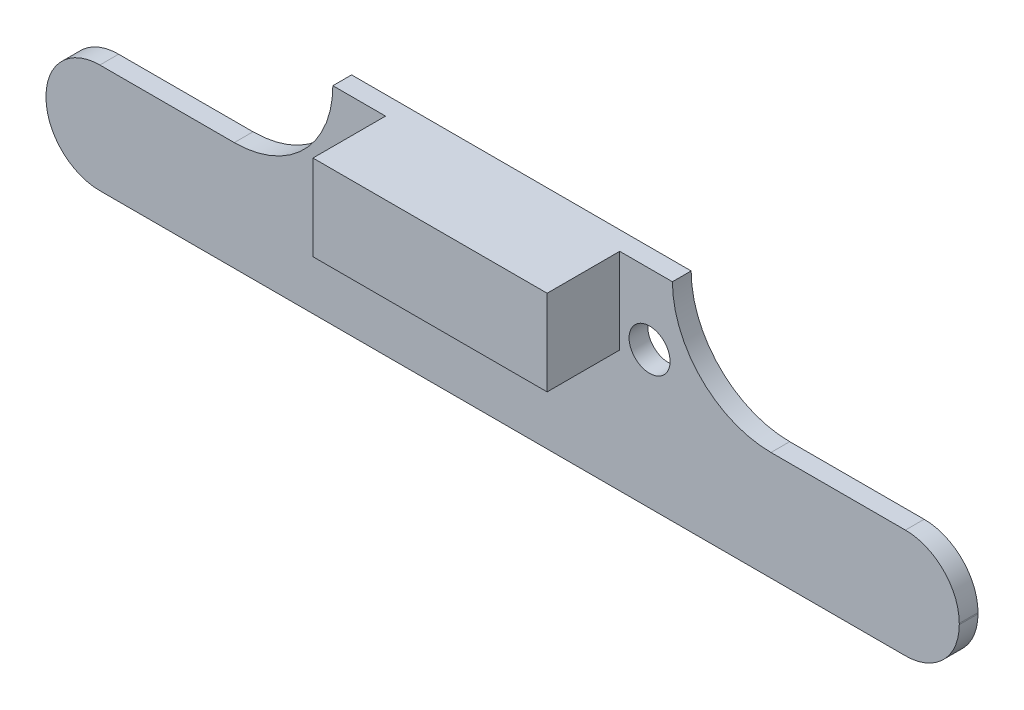
ISO-10303-21;
HEADER;
FILE_DESCRIPTION(('STEP AP214'),'2;1');
FILE_NAME('part.step','',(''),(''),'','','');
FILE_SCHEMA(('AUTOMOTIVE_DESIGN { 1 0 10303 214 1 1 1 1 }'));
ENDSEC;
DATA;
#1=APPLICATION_CONTEXT('core data for automotive mechanical design processes');
#2=APPLICATION_PROTOCOL_DEFINITION('international standard','automotive_design',2000,#1);
#3=PRODUCT_CONTEXT('',#1,'mechanical');
#4=PRODUCT('Part','Part','',(#3));
#5=PRODUCT_RELATED_PRODUCT_CATEGORY('part','',(#4));
#6=PRODUCT_DEFINITION_FORMATION('','',#4);
#7=PRODUCT_DEFINITION_CONTEXT('part definition',#1,'design');
#8=PRODUCT_DEFINITION('design','',#6,#7);
#9=PRODUCT_DEFINITION_SHAPE('','',#8);
#10=(LENGTH_UNIT() NAMED_UNIT(*) SI_UNIT(.MILLI.,.METRE.));
#11=(NAMED_UNIT(*) PLANE_ANGLE_UNIT() SI_UNIT($,.RADIAN.));
#12=(NAMED_UNIT(*) SI_UNIT($,.STERADIAN.) SOLID_ANGLE_UNIT());
#13=UNCERTAINTY_MEASURE_WITH_UNIT(LENGTH_MEASURE(1.E-05),#10,'distance_accuracy_value','');
#14=(GEOMETRIC_REPRESENTATION_CONTEXT(3) GLOBAL_UNCERTAINTY_ASSIGNED_CONTEXT((#13)) GLOBAL_UNIT_ASSIGNED_CONTEXT((#10,
#11,#12)) REPRESENTATION_CONTEXT('',''));
#15=CARTESIAN_POINT('',(0.,0.,0.));
#16=DIRECTION('',(0.,0.,1.));
#17=DIRECTION('',(1.,0.,0.));
#18=AXIS2_PLACEMENT_3D('',#15,#16,#17);
#19=CARTESIAN_POINT('',(73.4,4.7,1.6));
#20=DIRECTION('',(0.,0.,-1.));
#21=DIRECTION('',(-1.,0.,0.));
#22=AXIS2_PLACEMENT_3D('',#19,#20,#21);
#23=PLANE('',#22);
#24=CARTESIAN_POINT('',(51.55,11.72,1.6));
#25=DIRECTION('',(0.,0.,1.));
#26=DIRECTION('',(-1.,0.,0.));
#27=AXIS2_PLACEMENT_3D('',#24,#25,#26);
#28=CIRCLE('',#27,1.75);
#29=CARTESIAN_POINT('',(49.8,11.72,1.6));
#30=VERTEX_POINT('',#29);
#31=EDGE_CURVE('E201',#30,#30,#28,.T.);
#32=ORIENTED_EDGE('',*,*,#31,.F.);
#33=EDGE_LOOP('',(#32));
#34=FACE_BOUND('',#33,.T.);
#35=CARTESIAN_POINT('',(26.45,11.72,1.6));
#36=DIRECTION('',(0.,0.,1.));
#37=DIRECTION('',(1.,0.,0.));
#38=AXIS2_PLACEMENT_3D('',#35,#36,#37);
#39=CIRCLE('',#38,1.75);
#40=CARTESIAN_POINT('',(28.2,11.72,1.6));
#41=VERTEX_POINT('',#40);
#42=EDGE_CURVE('E249',#41,#41,#39,.T.);
#43=ORIENTED_EDGE('',*,*,#42,.F.);
#44=EDGE_LOOP('',(#43));
#45=FACE_BOUND('',#44,.T.);
#46=DIRECTION('',(0.,1.,0.));
#47=VECTOR('',#46,1.);
#48=CARTESIAN_POINT('',(49.,10.42,1.6));
#49=LINE('',#48,#47);
#50=CARTESIAN_POINT('',(49.,10.42,1.6));
#51=VERTEX_POINT('',#50);
#52=CARTESIAN_POINT('',(49.,17.72,1.6));
#53=VERTEX_POINT('',#52);
#54=EDGE_CURVE('E43',#51,#53,#49,.T.);
#55=ORIENTED_EDGE('',*,*,#54,.F.);
#56=DIRECTION('',(1.,0.,0.));
#57=VECTOR('',#56,1.);
#58=CARTESIAN_POINT('',(29.,10.42,1.6));
#59=LINE('',#58,#57);
#60=CARTESIAN_POINT('',(29.,10.42,1.6));
#61=VERTEX_POINT('',#60);
#62=EDGE_CURVE('E192',#61,#51,#59,.T.);
#63=ORIENTED_EDGE('',*,*,#62,.F.);
#64=DIRECTION('',(0.,-1.,0.));
#65=VECTOR('',#64,1.);
#66=CARTESIAN_POINT('',(29.,10.42,1.6));
#67=LINE('',#66,#65);
#68=CARTESIAN_POINT('',(29.,17.72,1.6));
#69=VERTEX_POINT('',#68);
#70=EDGE_CURVE('E69',#69,#61,#67,.T.);
#71=ORIENTED_EDGE('',*,*,#70,.F.);
#72=DIRECTION('',(-1.,0.,0.));
#73=VECTOR('',#72,1.);
#74=CARTESIAN_POINT('',(24.5,17.72,1.6));
#75=LINE('',#74,#73);
#76=CARTESIAN_POINT('',(24.5,17.72,1.6));
#77=VERTEX_POINT('',#76);
#78=EDGE_CURVE('E214',#69,#77,#75,.T.);
#79=ORIENTED_EDGE('',*,*,#78,.T.);
#80=CARTESIAN_POINT('',(16.08,17.72,1.6));
#81=DIRECTION('',(0.,0.,-1.));
#82=DIRECTION('',(-1.,0.,0.));
#83=AXIS2_PLACEMENT_3D('',#80,#81,#82);
#84=CIRCLE('',#83,8.42);
#85=CARTESIAN_POINT('',(16.08,9.30000000000001,1.6));
#86=VERTEX_POINT('',#85);
#87=EDGE_CURVE('E224',#77,#86,#84,.T.);
#88=ORIENTED_EDGE('',*,*,#87,.T.);
#89=DIRECTION('',(-1.,0.,0.));
#90=VECTOR('',#89,1.);
#91=CARTESIAN_POINT('',(4.60000000000003,9.3,1.6));
#92=LINE('',#91,#90);
#93=CARTESIAN_POINT('',(4.60000000000003,9.3,1.6));
#94=VERTEX_POINT('',#93);
#95=EDGE_CURVE('E228',#86,#94,#92,.T.);
#96=ORIENTED_EDGE('',*,*,#95,.T.);
#97=CARTESIAN_POINT('',(4.6,4.7,1.6));
#98=DIRECTION('',(0.,0.,1.));
#99=DIRECTION('',(-1.,0.,0.));
#100=AXIS2_PLACEMENT_3D('',#97,#98,#99);
#101=CIRCLE('',#100,4.6);
#102=CARTESIAN_POINT('',(0.,4.69999999999997,1.6));
#103=VERTEX_POINT('',#102);
#104=EDGE_CURVE('E230',#94,#103,#101,.T.);
#105=ORIENTED_EDGE('',*,*,#104,.T.);
#106=DIRECTION('',(0.,-1.,0.));
#107=VECTOR('',#106,1.);
#108=CARTESIAN_POINT('',(0.,4.60000000000003,1.6));
#109=LINE('',#108,#107);
#110=CARTESIAN_POINT('',(0.,4.60000000000003,1.6));
#111=VERTEX_POINT('',#110);
#112=EDGE_CURVE('E232',#103,#111,#109,.T.);
#113=ORIENTED_EDGE('',*,*,#112,.T.);
#114=CARTESIAN_POINT('',(4.6,4.6,1.6));
#115=DIRECTION('',(0.,0.,1.));
#116=DIRECTION('',(1.,0.,0.));
#117=AXIS2_PLACEMENT_3D('',#114,#115,#116);
#118=CIRCLE('',#117,4.6);
#119=CARTESIAN_POINT('',(4.60000000000003,0.,1.6));
#120=VERTEX_POINT('',#119);
#121=EDGE_CURVE('E234',#111,#120,#118,.T.);
#122=ORIENTED_EDGE('',*,*,#121,.T.);
#123=DIRECTION('',(1.,0.,0.));
#124=VECTOR('',#123,1.);
#125=CARTESIAN_POINT('',(4.60000000000003,0.,1.6));
#126=LINE('',#125,#124);
#127=CARTESIAN_POINT('',(73.4,0.,1.6));
#128=VERTEX_POINT('',#127);
#129=EDGE_CURVE('E236',#120,#128,#126,.T.);
#130=ORIENTED_EDGE('',*,*,#129,.T.);
#131=CARTESIAN_POINT('',(73.4,4.6,1.6));
#132=DIRECTION('',(0.,0.,1.));
#133=DIRECTION('',(1.,0.,0.));
#134=AXIS2_PLACEMENT_3D('',#131,#132,#133);
#135=CIRCLE('',#134,4.6);
#136=CARTESIAN_POINT('',(78.,4.60000000000003,1.6));
#137=VERTEX_POINT('',#136);
#138=EDGE_CURVE('E239',#128,#137,#135,.T.);
#139=ORIENTED_EDGE('',*,*,#138,.T.);
#140=DIRECTION('',(0.,1.,0.));
#141=VECTOR('',#140,1.);
#142=CARTESIAN_POINT('',(78.,4.60000000000003,1.6));
#143=LINE('',#142,#141);
#144=CARTESIAN_POINT('',(78.,4.69999999999997,1.6));
#145=VERTEX_POINT('',#144);
#146=EDGE_CURVE('E241',#137,#145,#143,.T.);
#147=ORIENTED_EDGE('',*,*,#146,.T.);
#148=CARTESIAN_POINT('',(73.4,4.7,1.6));
#149=DIRECTION('',(0.,0.,1.));
#150=DIRECTION('',(-1.,0.,0.));
#151=AXIS2_PLACEMENT_3D('',#148,#149,#150);
#152=CIRCLE('',#151,4.6);
#153=CARTESIAN_POINT('',(73.4,9.3,1.6));
#154=VERTEX_POINT('',#153);
#155=EDGE_CURVE('E275',#145,#154,#152,.T.);
#156=ORIENTED_EDGE('',*,*,#155,.T.);
#157=DIRECTION('',(-1.,0.,0.));
#158=VECTOR('',#157,1.);
#159=CARTESIAN_POINT('',(61.92,9.30000000000001,1.6));
#160=LINE('',#159,#158);
#161=CARTESIAN_POINT('',(61.92,9.30000000000001,1.6));
#162=VERTEX_POINT('',#161);
#163=EDGE_CURVE('E359',#154,#162,#160,.T.);
#164=ORIENTED_EDGE('',*,*,#163,.T.);
#165=CARTESIAN_POINT('',(61.92,17.72,1.6));
#166=DIRECTION('',(0.,0.,-1.));
#167=DIRECTION('',(1.,0.,0.));
#168=AXIS2_PLACEMENT_3D('',#165,#166,#167);
#169=CIRCLE('',#168,8.42);
#170=CARTESIAN_POINT('',(53.5,17.72,1.6));
#171=VERTEX_POINT('',#170);
#172=EDGE_CURVE('E219',#162,#171,#169,.T.);
#173=ORIENTED_EDGE('',*,*,#172,.T.);
#174=EDGE_CURVE('E218',#171,#53,#75,.T.);
#175=ORIENTED_EDGE('',*,*,#174,.T.);
#176=EDGE_LOOP('',(#55,#63,#71,#79,#88,#96,#105,#113,#122,#130,#139,#147,#156,#164,#173,#175));
#177=FACE_BOUND('',#176,.T.);
#178=ADVANCED_FACE('F39',(#34,#45,#177),#23,.F.);
#179=CARTESIAN_POINT('',(73.4,4.7,0.));
#180=DIRECTION('',(0.,0.,-1.));
#181=DIRECTION('',(-1.,0.,0.));
#182=AXIS2_PLACEMENT_3D('',#179,#180,#181);
#183=PLANE('',#182);
#184=CARTESIAN_POINT('',(26.45,11.72,0.));
#185=DIRECTION('',(0.,0.,1.));
#186=DIRECTION('',(1.,0.,0.));
#187=AXIS2_PLACEMENT_3D('',#184,#185,#186);
#188=CIRCLE('',#187,1.75);
#189=CARTESIAN_POINT('',(28.2,11.72,0.));
#190=VERTEX_POINT('',#189);
#191=EDGE_CURVE('E349',#190,#190,#188,.T.);
#192=ORIENTED_EDGE('',*,*,#191,.T.);
#193=EDGE_LOOP('',(#192));
#194=FACE_BOUND('',#193,.T.);
#195=CARTESIAN_POINT('',(73.4,4.7,0.));
#196=DIRECTION('',(0.,0.,1.));
#197=DIRECTION('',(-1.,0.,0.));
#198=AXIS2_PLACEMENT_3D('',#195,#196,#197);
#199=CIRCLE('',#198,4.6);
#200=CARTESIAN_POINT('',(78.,4.69999999999997,0.));
#201=VERTEX_POINT('',#200);
#202=CARTESIAN_POINT('',(73.4,9.3,0.));
#203=VERTEX_POINT('',#202);
#204=EDGE_CURVE('E244',#201,#203,#199,.T.);
#205=ORIENTED_EDGE('',*,*,#204,.F.);
#206=DIRECTION('',(0.,1.,0.));
#207=VECTOR('',#206,1.);
#208=CARTESIAN_POINT('',(78.,4.60000000000003,0.));
#209=LINE('',#208,#207);
#210=CARTESIAN_POINT('',(78.,4.60000000000003,0.));
#211=VERTEX_POINT('',#210);
#212=EDGE_CURVE('E273',#211,#201,#209,.T.);
#213=ORIENTED_EDGE('',*,*,#212,.F.);
#214=CARTESIAN_POINT('',(73.4,4.6,0.));
#215=DIRECTION('',(0.,0.,1.));
#216=DIRECTION('',(1.,0.,0.));
#217=AXIS2_PLACEMENT_3D('',#214,#215,#216);
#218=CIRCLE('',#217,4.6);
#219=CARTESIAN_POINT('',(73.4,0.,0.));
#220=VERTEX_POINT('',#219);
#221=EDGE_CURVE('E271',#220,#211,#218,.T.);
#222=ORIENTED_EDGE('',*,*,#221,.F.);
#223=DIRECTION('',(1.,0.,0.));
#224=VECTOR('',#223,1.);
#225=CARTESIAN_POINT('',(4.60000000000003,0.,0.));
#226=LINE('',#225,#224);
#227=CARTESIAN_POINT('',(4.60000000000003,0.,0.));
#228=VERTEX_POINT('',#227);
#229=EDGE_CURVE('E268',#228,#220,#226,.T.);
#230=ORIENTED_EDGE('',*,*,#229,.F.);
#231=CARTESIAN_POINT('',(4.6,4.6,0.));
#232=DIRECTION('',(0.,0.,1.));
#233=DIRECTION('',(1.,0.,0.));
#234=AXIS2_PLACEMENT_3D('',#231,#232,#233);
#235=CIRCLE('',#234,4.6);
#236=CARTESIAN_POINT('',(0.,4.60000000000003,0.));
#237=VERTEX_POINT('',#236);
#238=EDGE_CURVE('E266',#237,#228,#235,.T.);
#239=ORIENTED_EDGE('',*,*,#238,.F.);
#240=DIRECTION('',(0.,-1.,0.));
#241=VECTOR('',#240,1.);
#242=CARTESIAN_POINT('',(0.,4.60000000000003,0.));
#243=LINE('',#242,#241);
#244=CARTESIAN_POINT('',(0.,4.69999999999997,0.));
#245=VERTEX_POINT('',#244);
#246=EDGE_CURVE('E264',#245,#237,#243,.T.);
#247=ORIENTED_EDGE('',*,*,#246,.F.);
#248=CARTESIAN_POINT('',(4.6,4.7,0.));
#249=DIRECTION('',(0.,0.,1.));
#250=DIRECTION('',(-1.,0.,0.));
#251=AXIS2_PLACEMENT_3D('',#248,#249,#250);
#252=CIRCLE('',#251,4.6);
#253=CARTESIAN_POINT('',(4.60000000000003,9.3,0.));
#254=VERTEX_POINT('',#253);
#255=EDGE_CURVE('E262',#254,#245,#252,.T.);
#256=ORIENTED_EDGE('',*,*,#255,.F.);
#257=DIRECTION('',(-1.,0.,0.));
#258=VECTOR('',#257,1.);
#259=CARTESIAN_POINT('',(4.60000000000003,9.3,0.));
#260=LINE('',#259,#258);
#261=CARTESIAN_POINT('',(16.08,9.30000000000001,0.));
#262=VERTEX_POINT('',#261);
#263=EDGE_CURVE('E260',#262,#254,#260,.T.);
#264=ORIENTED_EDGE('',*,*,#263,.F.);
#265=CARTESIAN_POINT('',(16.08,17.72,0.));
#266=DIRECTION('',(0.,0.,-1.));
#267=DIRECTION('',(-1.,0.,0.));
#268=AXIS2_PLACEMENT_3D('',#265,#266,#267);
#269=CIRCLE('',#268,8.42);
#270=CARTESIAN_POINT('',(24.5,17.72,0.));
#271=VERTEX_POINT('',#270);
#272=EDGE_CURVE('E257',#271,#262,#269,.T.);
#273=ORIENTED_EDGE('',*,*,#272,.F.);
#274=DIRECTION('',(-1.,0.,0.));
#275=VECTOR('',#274,1.);
#276=CARTESIAN_POINT('',(24.5,17.72,0.));
#277=LINE('',#276,#275);
#278=CARTESIAN_POINT('',(53.5,17.72,0.));
#279=VERTEX_POINT('',#278);
#280=EDGE_CURVE('E255',#279,#271,#277,.T.);
#281=ORIENTED_EDGE('',*,*,#280,.F.);
#282=CARTESIAN_POINT('',(61.92,17.72,0.));
#283=DIRECTION('',(0.,0.,-1.));
#284=DIRECTION('',(1.,0.,0.));
#285=AXIS2_PLACEMENT_3D('',#282,#283,#284);
#286=CIRCLE('',#285,8.42);
#287=CARTESIAN_POINT('',(61.92,9.30000000000001,0.));
#288=VERTEX_POINT('',#287);
#289=EDGE_CURVE('E252',#288,#279,#286,.T.);
#290=ORIENTED_EDGE('',*,*,#289,.F.);
#291=DIRECTION('',(-1.,0.,0.));
#292=VECTOR('',#291,1.);
#293=CARTESIAN_POINT('',(61.92,9.30000000000001,0.));
#294=LINE('',#293,#292);
#295=EDGE_CURVE('E248',#203,#288,#294,.T.);
#296=ORIENTED_EDGE('',*,*,#295,.F.);
#297=EDGE_LOOP('',(#205,#213,#222,#230,#239,#247,#256,#264,#273,#281,#290,#296));
#298=FACE_BOUND('',#297,.T.);
#299=CARTESIAN_POINT('',(51.55,11.72,0.));
#300=DIRECTION('',(0.,0.,1.));
#301=DIRECTION('',(-1.,0.,0.));
#302=AXIS2_PLACEMENT_3D('',#299,#300,#301);
#303=CIRCLE('',#302,1.75);
#304=CARTESIAN_POINT('',(49.8,11.72,0.));
#305=VERTEX_POINT('',#304);
#306=EDGE_CURVE('E196',#305,#305,#303,.T.);
#307=ORIENTED_EDGE('',*,*,#306,.T.);
#308=EDGE_LOOP('',(#307));
#309=FACE_BOUND('',#308,.T.);
#310=ADVANCED_FACE('F319',(#194,#298,#309),#183,.T.);
#311=CARTESIAN_POINT('',(73.4,4.7,1.6));
#312=DIRECTION('',(0.,0.,-1.));
#313=DIRECTION('',(-1.,0.,0.));
#314=AXIS2_PLACEMENT_3D('',#311,#312,#313);
#315=CYLINDRICAL_SURFACE('',#314,4.6);
#316=ORIENTED_EDGE('',*,*,#204,.T.);
#317=DIRECTION('',(0.,0.,-1.));
#318=VECTOR('',#317,1.);
#319=CARTESIAN_POINT('',(73.4,9.3,1.6));
#320=LINE('',#319,#318);
#321=EDGE_CURVE('E11',#154,#203,#320,.T.);
#322=ORIENTED_EDGE('',*,*,#321,.F.);
#323=ORIENTED_EDGE('',*,*,#155,.F.);
#324=DIRECTION('',(0.,0.,-1.));
#325=VECTOR('',#324,1.);
#326=CARTESIAN_POINT('',(78.,4.69999999999997,1.6));
#327=LINE('',#326,#325);
#328=EDGE_CURVE('E243',#145,#201,#327,.T.);
#329=ORIENTED_EDGE('',*,*,#328,.T.);
#330=EDGE_LOOP('',(#316,#322,#323,#329));
#331=FACE_BOUND('',#330,.T.);
#332=ADVANCED_FACE('F41',(#331),#315,.T.);
#333=CARTESIAN_POINT('',(61.92,9.30000000000001,1.6));
#334=DIRECTION('',(0.,-1.,0.));
#335=DIRECTION('',(1.,0.,0.));
#336=AXIS2_PLACEMENT_3D('',#333,#334,#335);
#337=PLANE('',#336);
#338=ORIENTED_EDGE('',*,*,#295,.T.);
#339=DIRECTION('',(0.,0.,-1.));
#340=VECTOR('',#339,1.);
#341=CARTESIAN_POINT('',(61.92,9.30000000000001,1.6));
#342=LINE('',#341,#340);
#343=EDGE_CURVE('E50',#162,#288,#342,.T.);
#344=ORIENTED_EDGE('',*,*,#343,.F.);
#345=ORIENTED_EDGE('',*,*,#163,.F.);
#346=ORIENTED_EDGE('',*,*,#321,.T.);
#347=EDGE_LOOP('',(#338,#344,#345,#346));
#348=FACE_BOUND('',#347,.T.);
#349=ADVANCED_FACE('F366',(#348),#337,.F.);
#350=CARTESIAN_POINT('',(61.92,17.72,1.6));
#351=DIRECTION('',(0.,0.,-1.));
#352=DIRECTION('',(-1.,0.,0.));
#353=AXIS2_PLACEMENT_3D('',#350,#351,#352);
#354=CYLINDRICAL_SURFACE('',#353,8.42);
#355=ORIENTED_EDGE('',*,*,#289,.T.);
#356=DIRECTION('',(0.,0.,-1.));
#357=VECTOR('',#356,1.);
#358=CARTESIAN_POINT('',(53.5,17.72,1.6));
#359=LINE('',#358,#357);
#360=EDGE_CURVE('E303',#171,#279,#359,.T.);
#361=ORIENTED_EDGE('',*,*,#360,.F.);
#362=ORIENTED_EDGE('',*,*,#172,.F.);
#363=ORIENTED_EDGE('',*,*,#343,.T.);
#364=EDGE_LOOP('',(#355,#361,#362,#363));
#365=FACE_BOUND('',#364,.T.);
#366=ADVANCED_FACE('F313',(#365),#354,.F.);
#367=CARTESIAN_POINT('',(24.5,17.72,1.6));
#368=DIRECTION('',(0.,-1.,0.));
#369=DIRECTION('',(1.,0.,0.));
#370=AXIS2_PLACEMENT_3D('',#367,#368,#369);
#371=PLANE('',#370);
#372=ORIENTED_EDGE('',*,*,#280,.T.);
#373=DIRECTION('',(0.,0.,-1.));
#374=VECTOR('',#373,1.);
#375=CARTESIAN_POINT('',(24.5,17.72,1.6));
#376=LINE('',#375,#374);
#377=EDGE_CURVE('E299',#77,#271,#376,.T.);
#378=ORIENTED_EDGE('',*,*,#377,.F.);
#379=ORIENTED_EDGE('',*,*,#78,.F.);
#380=DIRECTION('',(0.,0.,-1.));
#381=VECTOR('',#380,1.);
#382=CARTESIAN_POINT('',(29.,17.72,7.8));
#383=LINE('',#382,#381);
#384=CARTESIAN_POINT('',(29.,17.72,7.8));
#385=VERTEX_POINT('',#384);
#386=EDGE_CURVE('E177',#385,#69,#383,.T.);
#387=ORIENTED_EDGE('',*,*,#386,.F.);
#388=DIRECTION('',(-1.,0.,0.));
#389=VECTOR('',#388,1.);
#390=CARTESIAN_POINT('',(29.,17.72,7.8));
#391=LINE('',#390,#389);
#392=CARTESIAN_POINT('',(49.,17.72,7.8));
#393=VERTEX_POINT('',#392);
#394=EDGE_CURVE('E170',#393,#385,#391,.T.);
#395=ORIENTED_EDGE('',*,*,#394,.F.);
#396=DIRECTION('',(0.,0.,-1.));
#397=VECTOR('',#396,1.);
#398=CARTESIAN_POINT('',(49.,17.72,7.8));
#399=LINE('',#398,#397);
#400=EDGE_CURVE('E175',#393,#53,#399,.T.);
#401=ORIENTED_EDGE('',*,*,#400,.T.);
#402=ORIENTED_EDGE('',*,*,#174,.F.);
#403=ORIENTED_EDGE('',*,*,#360,.T.);
#404=EDGE_LOOP('',(#372,#378,#379,#387,#395,#401,#402,#403));
#405=FACE_BOUND('',#404,.T.);
#406=ADVANCED_FACE('F172',(#405),#371,.F.);
#407=CARTESIAN_POINT('',(16.08,17.72,1.6));
#408=DIRECTION('',(0.,0.,-1.));
#409=DIRECTION('',(-1.,0.,0.));
#410=AXIS2_PLACEMENT_3D('',#407,#408,#409);
#411=CYLINDRICAL_SURFACE('',#410,8.42);
#412=ORIENTED_EDGE('',*,*,#272,.T.);
#413=DIRECTION('',(0.,0.,-1.));
#414=VECTOR('',#413,1.);
#415=CARTESIAN_POINT('',(16.08,9.30000000000001,1.6));
#416=LINE('',#415,#414);
#417=EDGE_CURVE('E296',#86,#262,#416,.T.);
#418=ORIENTED_EDGE('',*,*,#417,.F.);
#419=ORIENTED_EDGE('',*,*,#87,.F.);
#420=ORIENTED_EDGE('',*,*,#377,.T.);
#421=EDGE_LOOP('',(#412,#418,#419,#420));
#422=FACE_BOUND('',#421,.T.);
#423=ADVANCED_FACE('F326',(#422),#411,.F.);
#424=CARTESIAN_POINT('',(4.60000000000003,9.3,1.6));
#425=DIRECTION('',(0.,-1.,0.));
#426=DIRECTION('',(1.,0.,0.));
#427=AXIS2_PLACEMENT_3D('',#424,#425,#426);
#428=PLANE('',#427);
#429=ORIENTED_EDGE('',*,*,#263,.T.);
#430=DIRECTION('',(0.,0.,-1.));
#431=VECTOR('',#430,1.);
#432=CARTESIAN_POINT('',(4.60000000000003,9.3,1.6));
#433=LINE('',#432,#431);
#434=EDGE_CURVE('E293',#94,#254,#433,.T.);
#435=ORIENTED_EDGE('',*,*,#434,.F.);
#436=ORIENTED_EDGE('',*,*,#95,.F.);
#437=ORIENTED_EDGE('',*,*,#417,.T.);
#438=EDGE_LOOP('',(#429,#435,#436,#437));
#439=FACE_BOUND('',#438,.T.);
#440=ADVANCED_FACE('F399',(#439),#428,.F.);
#441=CARTESIAN_POINT('',(4.6,4.7,1.6));
#442=DIRECTION('',(0.,0.,-1.));
#443=DIRECTION('',(-1.,0.,0.));
#444=AXIS2_PLACEMENT_3D('',#441,#442,#443);
#445=CYLINDRICAL_SURFACE('',#444,4.6);
#446=ORIENTED_EDGE('',*,*,#255,.T.);
#447=DIRECTION('',(0.,0.,-1.));
#448=VECTOR('',#447,1.);
#449=CARTESIAN_POINT('',(0.,4.69999999999997,1.6));
#450=LINE('',#449,#448);
#451=EDGE_CURVE('E290',#103,#245,#450,.T.);
#452=ORIENTED_EDGE('',*,*,#451,.F.);
#453=ORIENTED_EDGE('',*,*,#104,.F.);
#454=ORIENTED_EDGE('',*,*,#434,.T.);
#455=EDGE_LOOP('',(#446,#452,#453,#454));
#456=FACE_BOUND('',#455,.T.);
#457=ADVANCED_FACE('F397',(#456),#445,.T.);
#458=CARTESIAN_POINT('',(0.,4.60000000000003,1.6));
#459=DIRECTION('',(1.,0.,0.));
#460=DIRECTION('',(0.,0.,-1.));
#461=AXIS2_PLACEMENT_3D('',#458,#459,#460);
#462=PLANE('',#461);
#463=ORIENTED_EDGE('',*,*,#246,.T.);
#464=DIRECTION('',(0.,0.,-1.));
#465=VECTOR('',#464,1.);
#466=CARTESIAN_POINT('',(0.,4.60000000000003,1.6));
#467=LINE('',#466,#465);
#468=EDGE_CURVE('E287',#111,#237,#467,.T.);
#469=ORIENTED_EDGE('',*,*,#468,.F.);
#470=ORIENTED_EDGE('',*,*,#112,.F.);
#471=ORIENTED_EDGE('',*,*,#451,.T.);
#472=EDGE_LOOP('',(#463,#469,#470,#471));
#473=FACE_BOUND('',#472,.T.);
#474=ADVANCED_FACE('F393',(#473),#462,.F.);
#475=CARTESIAN_POINT('',(4.6,4.6,1.6));
#476=DIRECTION('',(0.,0.,-1.));
#477=DIRECTION('',(-1.,0.,0.));
#478=AXIS2_PLACEMENT_3D('',#475,#476,#477);
#479=CYLINDRICAL_SURFACE('',#478,4.6);
#480=ORIENTED_EDGE('',*,*,#238,.T.);
#481=DIRECTION('',(0.,0.,-1.));
#482=VECTOR('',#481,1.);
#483=CARTESIAN_POINT('',(4.60000000000003,0.,1.6));
#484=LINE('',#483,#482);
#485=EDGE_CURVE('E284',#120,#228,#484,.T.);
#486=ORIENTED_EDGE('',*,*,#485,.F.);
#487=ORIENTED_EDGE('',*,*,#121,.F.);
#488=ORIENTED_EDGE('',*,*,#468,.T.);
#489=EDGE_LOOP('',(#480,#486,#487,#488));
#490=FACE_BOUND('',#489,.T.);
#491=ADVANCED_FACE('F388',(#490),#479,.T.);
#492=CARTESIAN_POINT('',(4.60000000000003,0.,1.6));
#493=DIRECTION('',(0.,1.,0.));
#494=DIRECTION('',(0.,0.,1.));
#495=AXIS2_PLACEMENT_3D('',#492,#493,#494);
#496=PLANE('',#495);
#497=ORIENTED_EDGE('',*,*,#229,.T.);
#498=DIRECTION('',(0.,0.,-1.));
#499=VECTOR('',#498,1.);
#500=CARTESIAN_POINT('',(73.4,0.,1.6));
#501=LINE('',#500,#499);
#502=EDGE_CURVE('E281',#128,#220,#501,.T.);
#503=ORIENTED_EDGE('',*,*,#502,.F.);
#504=ORIENTED_EDGE('',*,*,#129,.F.);
#505=ORIENTED_EDGE('',*,*,#485,.T.);
#506=EDGE_LOOP('',(#497,#503,#504,#505));
#507=FACE_BOUND('',#506,.T.);
#508=ADVANCED_FACE('F382',(#507),#496,.F.);
#509=CARTESIAN_POINT('',(73.4,4.6,1.6));
#510=DIRECTION('',(0.,0.,-1.));
#511=DIRECTION('',(-1.,0.,0.));
#512=AXIS2_PLACEMENT_3D('',#509,#510,#511);
#513=CYLINDRICAL_SURFACE('',#512,4.6);
#514=ORIENTED_EDGE('',*,*,#221,.T.);
#515=DIRECTION('',(0.,0.,-1.));
#516=VECTOR('',#515,1.);
#517=CARTESIAN_POINT('',(78.,4.60000000000003,1.6));
#518=LINE('',#517,#516);
#519=EDGE_CURVE('E278',#137,#211,#518,.T.);
#520=ORIENTED_EDGE('',*,*,#519,.F.);
#521=ORIENTED_EDGE('',*,*,#138,.F.);
#522=ORIENTED_EDGE('',*,*,#502,.T.);
#523=EDGE_LOOP('',(#514,#520,#521,#522));
#524=FACE_BOUND('',#523,.T.);
#525=ADVANCED_FACE('F378',(#524),#513,.T.);
#526=CARTESIAN_POINT('',(78.,4.60000000000003,1.6));
#527=DIRECTION('',(-1.,0.,0.));
#528=DIRECTION('',(0.,0.,1.));
#529=AXIS2_PLACEMENT_3D('',#526,#527,#528);
#530=PLANE('',#529);
#531=ORIENTED_EDGE('',*,*,#212,.T.);
#532=ORIENTED_EDGE('',*,*,#328,.F.);
#533=ORIENTED_EDGE('',*,*,#146,.F.);
#534=ORIENTED_EDGE('',*,*,#519,.T.);
#535=EDGE_LOOP('',(#531,#532,#533,#534));
#536=FACE_BOUND('',#535,.T.);
#537=ADVANCED_FACE('F373',(#536),#530,.F.);
#538=CARTESIAN_POINT('',(26.45,11.72,1.6));
#539=DIRECTION('',(0.,0.,-1.));
#540=DIRECTION('',(-1.,0.,0.));
#541=AXIS2_PLACEMENT_3D('',#538,#539,#540);
#542=CYLINDRICAL_SURFACE('',#541,1.75);
#543=ORIENTED_EDGE('',*,*,#42,.T.);
#544=EDGE_LOOP('',(#543));
#545=FACE_BOUND('',#544,.T.);
#546=ORIENTED_EDGE('',*,*,#191,.F.);
#547=EDGE_LOOP('',(#546));
#548=FACE_BOUND('',#547,.T.);
#549=ADVANCED_FACE('F419',(#545,#548),#542,.F.);
#550=CARTESIAN_POINT('',(51.55,11.72,1.6));
#551=DIRECTION('',(0.,0.,-1.));
#552=DIRECTION('',(-1.,0.,0.));
#553=AXIS2_PLACEMENT_3D('',#550,#551,#552);
#554=CYLINDRICAL_SURFACE('',#553,1.75);
#555=ORIENTED_EDGE('',*,*,#31,.T.);
#556=EDGE_LOOP('',(#555));
#557=FACE_BOUND('',#556,.T.);
#558=ORIENTED_EDGE('',*,*,#306,.F.);
#559=EDGE_LOOP('',(#558));
#560=FACE_BOUND('',#559,.T.);
#561=ADVANCED_FACE('F458',(#557,#560),#554,.F.);
#562=CARTESIAN_POINT('',(49.,10.42,7.8));
#563=DIRECTION('',(-1.,0.,0.));
#564=DIRECTION('',(0.,0.,1.));
#565=AXIS2_PLACEMENT_3D('',#562,#563,#564);
#566=PLANE('',#565);
#567=ORIENTED_EDGE('',*,*,#54,.T.);
#568=ORIENTED_EDGE('',*,*,#400,.F.);
#569=DIRECTION('',(0.,1.,0.));
#570=VECTOR('',#569,1.);
#571=CARTESIAN_POINT('',(49.,10.42,7.8));
#572=LINE('',#571,#570);
#573=CARTESIAN_POINT('',(49.,10.42,7.8));
#574=VERTEX_POINT('',#573);
#575=EDGE_CURVE('E182',#574,#393,#572,.T.);
#576=ORIENTED_EDGE('',*,*,#575,.F.);
#577=DIRECTION('',(0.,0.,-1.));
#578=VECTOR('',#577,1.);
#579=CARTESIAN_POINT('',(49.,10.42,7.8));
#580=LINE('',#579,#578);
#581=EDGE_CURVE('E338',#574,#51,#580,.T.);
#582=ORIENTED_EDGE('',*,*,#581,.T.);
#583=EDGE_LOOP('',(#567,#568,#576,#582));
#584=FACE_BOUND('',#583,.T.);
#585=ADVANCED_FACE('F194',(#584),#566,.F.);
#586=CARTESIAN_POINT('',(29.,10.42,7.8));
#587=DIRECTION('',(1.,0.,0.));
#588=DIRECTION('',(0.,0.,-1.));
#589=AXIS2_PLACEMENT_3D('',#586,#587,#588);
#590=PLANE('',#589);
#591=ORIENTED_EDGE('',*,*,#70,.T.);
#592=DIRECTION('',(0.,0.,-1.));
#593=VECTOR('',#592,1.);
#594=CARTESIAN_POINT('',(29.,10.42,7.8));
#595=LINE('',#594,#593);
#596=CARTESIAN_POINT('',(29.,10.42,7.8));
#597=VERTEX_POINT('',#596);
#598=EDGE_CURVE('E204',#597,#61,#595,.T.);
#599=ORIENTED_EDGE('',*,*,#598,.F.);
#600=DIRECTION('',(0.,-1.,0.));
#601=VECTOR('',#600,1.);
#602=CARTESIAN_POINT('',(29.,10.42,7.8));
#603=LINE('',#602,#601);
#604=EDGE_CURVE('E181',#385,#597,#603,.T.);
#605=ORIENTED_EDGE('',*,*,#604,.F.);
#606=ORIENTED_EDGE('',*,*,#386,.T.);
#607=EDGE_LOOP('',(#591,#599,#605,#606));
#608=FACE_BOUND('',#607,.T.);
#609=ADVANCED_FACE('F331',(#608),#590,.F.);
#610=CARTESIAN_POINT('',(29.,10.42,7.8));
#611=DIRECTION('',(0.,1.,0.));
#612=DIRECTION('',(0.,0.,1.));
#613=AXIS2_PLACEMENT_3D('',#610,#611,#612);
#614=PLANE('',#613);
#615=ORIENTED_EDGE('',*,*,#62,.T.);
#616=ORIENTED_EDGE('',*,*,#581,.F.);
#617=DIRECTION('',(1.,0.,0.));
#618=VECTOR('',#617,1.);
#619=CARTESIAN_POINT('',(29.,10.42,7.8));
#620=LINE('',#619,#618);
#621=EDGE_CURVE('E187',#597,#574,#620,.T.);
#622=ORIENTED_EDGE('',*,*,#621,.F.);
#623=ORIENTED_EDGE('',*,*,#598,.T.);
#624=EDGE_LOOP('',(#615,#616,#622,#623));
#625=FACE_BOUND('',#624,.T.);
#626=ADVANCED_FACE('F476',(#625),#614,.F.);
#627=CARTESIAN_POINT('',(0.,0.,7.8));
#628=DIRECTION('',(0.,0.,-1.));
#629=DIRECTION('',(-1.,0.,0.));
#630=AXIS2_PLACEMENT_3D('',#627,#628,#629);
#631=PLANE('',#630);
#632=ORIENTED_EDGE('',*,*,#575,.T.);
#633=ORIENTED_EDGE('',*,*,#394,.T.);
#634=ORIENTED_EDGE('',*,*,#604,.T.);
#635=ORIENTED_EDGE('',*,*,#621,.T.);
#636=EDGE_LOOP('',(#632,#633,#634,#635));
#637=FACE_BOUND('',#636,.T.);
#638=ADVANCED_FACE('F185',(#637),#631,.F.);
#639=CLOSED_SHELL('',(#178,#310,#332,#349,#366,#406,#423,#440,#457,#474,#491,#508,#525,#537,
#549,#561,#585,#609,#626,#638));
#640=MANIFOLD_SOLID_BREP('B2',#639);
#641=ADVANCED_BREP_SHAPE_REPRESENTATION('',(#18,#640),#14);
#642=SHAPE_DEFINITION_REPRESENTATION(#9,#641);
ENDSEC;
END-ISO-10303-21;
